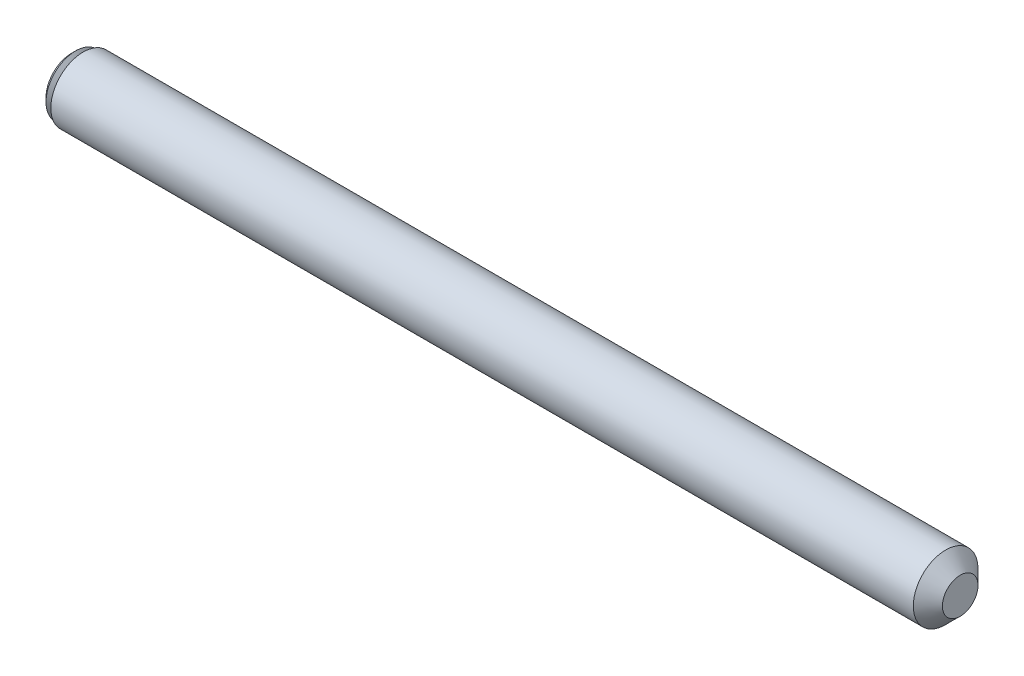
ISO-10303-21;
HEADER;
FILE_DESCRIPTION(('STEP AP214'),'2;1');
FILE_NAME('part.step','',(''),(''),'','','');
FILE_SCHEMA(('AUTOMOTIVE_DESIGN { 1 0 10303 214 1 1 1 1 }'));
ENDSEC;
DATA;
#1=APPLICATION_CONTEXT('core data for automotive mechanical design processes');
#2=APPLICATION_PROTOCOL_DEFINITION('international standard','automotive_design',2000,#1);
#3=PRODUCT_CONTEXT('',#1,'mechanical');
#4=PRODUCT('Part','Part','',(#3));
#5=PRODUCT_RELATED_PRODUCT_CATEGORY('part','',(#4));
#6=PRODUCT_DEFINITION_FORMATION('','',#4);
#7=PRODUCT_DEFINITION_CONTEXT('part definition',#1,'design');
#8=PRODUCT_DEFINITION('design','',#6,#7);
#9=PRODUCT_DEFINITION_SHAPE('','',#8);
#10=(LENGTH_UNIT() NAMED_UNIT(*) SI_UNIT(.MILLI.,.METRE.));
#11=(NAMED_UNIT(*) PLANE_ANGLE_UNIT() SI_UNIT($,.RADIAN.));
#12=(NAMED_UNIT(*) SI_UNIT($,.STERADIAN.) SOLID_ANGLE_UNIT());
#13=UNCERTAINTY_MEASURE_WITH_UNIT(LENGTH_MEASURE(1.E-05),#10,'distance_accuracy_value','');
#14=(GEOMETRIC_REPRESENTATION_CONTEXT(3) GLOBAL_UNCERTAINTY_ASSIGNED_CONTEXT((#13)) GLOBAL_UNIT_ASSIGNED_CONTEXT((#10,
#11,#12)) REPRESENTATION_CONTEXT('',''));
#15=CARTESIAN_POINT('',(0.,0.,0.));
#16=DIRECTION('',(0.,0.,1.));
#17=DIRECTION('',(1.,0.,0.));
#18=AXIS2_PLACEMENT_3D('',#15,#16,#17);
#19=CARTESIAN_POINT('',(108.999999932,2.1844,0.));
#20=DIRECTION('',(1.,0.,0.));
#21=DIRECTION('',(0.,0.,-1.));
#22=AXIS2_PLACEMENT_3D('',#19,#20,#21);
#23=PLANE('',#22);
#24=CARTESIAN_POINT('',(108.999999932,0.,0.));
#25=DIRECTION('',(-1.,0.,0.));
#26=DIRECTION('',(0.,0.,1.));
#27=AXIS2_PLACEMENT_3D('',#24,#25,#26);
#28=CIRCLE('',#27,2.1844);
#29=CARTESIAN_POINT('',(108.999999932,0.,2.1844));
#30=VERTEX_POINT('',#29);
#31=EDGE_CURVE('E10',#30,#30,#28,.T.);
#32=ORIENTED_EDGE('',*,*,#31,.F.);
#33=EDGE_LOOP('',(#32));
#34=FACE_BOUND('',#33,.T.);
#35=ADVANCED_FACE('F31',(#34),#23,.T.);
#36=CARTESIAN_POINT('',(107.215649932,0.,0.));
#37=DIRECTION('',(-1.,0.,0.));
#38=DIRECTION('',(0.,0.,1.));
#39=AXIS2_PLACEMENT_3D('',#36,#37,#38);
#40=CONICAL_SURFACE('',#39,3.96875,0.785398163397397);
#41=ORIENTED_EDGE('',*,*,#31,.T.);
#42=EDGE_LOOP('',(#41));
#43=FACE_BOUND('',#42,.T.);
#44=CARTESIAN_POINT('',(107.215649932,0.,0.));
#45=DIRECTION('',(-1.,0.,0.));
#46=DIRECTION('',(0.,0.,1.));
#47=AXIS2_PLACEMENT_3D('',#44,#45,#46);
#48=CIRCLE('',#47,3.96875);
#49=CARTESIAN_POINT('',(107.215649932,0.,3.96875));
#50=VERTEX_POINT('',#49);
#51=EDGE_CURVE('E38',#50,#50,#48,.T.);
#52=ORIENTED_EDGE('',*,*,#51,.F.);
#53=EDGE_LOOP('',(#52));
#54=FACE_BOUND('',#53,.T.);
#55=ADVANCED_FACE('F65',(#43,#54),#40,.T.);
#56=CARTESIAN_POINT('',(-12.7,0.,0.));
#57=DIRECTION('',(-1.,0.,0.));
#58=DIRECTION('',(0.,0.,1.));
#59=AXIS2_PLACEMENT_3D('',#56,#57,#58);
#60=CYLINDRICAL_SURFACE('',#59,3.96875);
#61=CARTESIAN_POINT('',(1.42727322210089,0.,0.));
#62=DIRECTION('',(-1.,0.,0.));
#63=DIRECTION('',(0.,-1.,0.));
#64=AXIS2_PLACEMENT_3D('',#61,#62,#63);
#65=CIRCLE('',#64,3.96875);
#66=CARTESIAN_POINT('',(1.42727322210089,-3.96875,0.));
#67=VERTEX_POINT('',#66);
#68=EDGE_CURVE('E47',#67,#67,#65,.T.);
#69=ORIENTED_EDGE('',*,*,#68,.F.);
#70=EDGE_LOOP('',(#69));
#71=FACE_BOUND('',#70,.T.);
#72=ORIENTED_EDGE('',*,*,#51,.T.);
#73=EDGE_LOOP('',(#72));
#74=FACE_BOUND('',#73,.T.);
#75=ADVANCED_FACE('F59',(#71,#74),#60,.T.);
#76=CARTESIAN_POINT('',(1.42727322210089,0.,0.));
#77=DIRECTION('',(1.,0.,0.));
#78=DIRECTION('',(0.,1.,0.));
#79=AXIS2_PLACEMENT_3D('',#76,#77,#78);
#80=CONICAL_SURFACE('',#79,3.96875,0.959931088596885);
#81=CARTESIAN_POINT('',(0.839469999999993,0.,0.));
#82=DIRECTION('',(-1.,0.,0.));
#83=DIRECTION('',(0.,-1.,0.));
#84=AXIS2_PLACEMENT_3D('',#81,#82,#83);
#85=CIRCLE('',#84,3.12928);
#86=CARTESIAN_POINT('',(0.839469999999994,-3.12928,0.));
#87=VERTEX_POINT('',#86);
#88=EDGE_CURVE('E50',#87,#87,#85,.T.);
#89=ORIENTED_EDGE('',*,*,#88,.F.);
#90=EDGE_LOOP('',(#89));
#91=FACE_BOUND('',#90,.T.);
#92=ORIENTED_EDGE('',*,*,#68,.T.);
#93=EDGE_LOOP('',(#92));
#94=FACE_BOUND('',#93,.T.);
#95=ADVANCED_FACE('F56',(#91,#94),#80,.T.);
#96=CARTESIAN_POINT('',(0.839469999999993,0.,0.));
#97=DIRECTION('',(-1.,0.,0.));
#98=DIRECTION('',(0.,-1.,0.));
#99=AXIS2_PLACEMENT_3D('',#96,#97,#98);
#100=CONICAL_SURFACE('',#99,3.12928,0.959931088596876);
#101=CARTESIAN_POINT('',(0.49374560524766,0.,0.));
#102=DIRECTION('',(-1.,0.,0.));
#103=DIRECTION('',(0.,-1.,0.));
#104=AXIS2_PLACEMENT_3D('',#101,#102,#103);
#105=CIRCLE('',#104,3.62302560524766);
#106=CARTESIAN_POINT('',(0.49374560524766,-3.62302560524766,0.));
#107=VERTEX_POINT('',#106);
#108=EDGE_CURVE('E34',#107,#107,#105,.F.);
#109=ORIENTED_EDGE('',*,*,#108,.T.);
#110=EDGE_LOOP('',(#109));
#111=FACE_BOUND('',#110,.T.);
#112=ORIENTED_EDGE('',*,*,#88,.T.);
#113=EDGE_LOOP('',(#112));
#114=FACE_BOUND('',#113,.T.);
#115=ADVANCED_FACE('F54',(#111,#114),#100,.T.);
#116=CARTESIAN_POINT('',(0.,0.,0.));
#117=DIRECTION('',(-1.,0.,0.));
#118=DIRECTION('',(0.,0.,1.));
#119=AXIS2_PLACEMENT_3D('',#116,#117,#118);
#120=PLANE('',#119);
#121=CARTESIAN_POINT('',(0.,0.,0.));
#122=DIRECTION('',(-1.,0.,0.));
#123=DIRECTION('',(0.,0.,1.));
#124=AXIS2_PLACEMENT_3D('',#121,#122,#123);
#125=CIRCLE('',#124,3.12928);
#126=CARTESIAN_POINT('',(0.,0.,3.12928));
#127=VERTEX_POINT('',#126);
#128=EDGE_CURVE('E42',#127,#127,#125,.T.);
#129=ORIENTED_EDGE('',*,*,#128,.T.);
#130=EDGE_LOOP('',(#129));
#131=FACE_BOUND('',#130,.T.);
#132=ADVANCED_FACE('F78',(#131),#120,.T.);
#133=CARTESIAN_POINT('',(0.,0.,0.));
#134=DIRECTION('',(1.,0.,0.));
#135=DIRECTION('',(0.,0.,-1.));
#136=AXIS2_PLACEMENT_3D('',#133,#134,#135);
#137=CONICAL_SURFACE('',#136,3.12928,0.785398163397452);
#138=ORIENTED_EDGE('',*,*,#108,.F.);
#139=EDGE_LOOP('',(#138));
#140=FACE_BOUND('',#139,.T.);
#141=ORIENTED_EDGE('',*,*,#128,.F.);
#142=EDGE_LOOP('',(#141));
#143=FACE_BOUND('',#142,.T.);
#144=ADVANCED_FACE('F75',(#140,#143),#137,.T.);
#145=CLOSED_SHELL('',(#35,#55,#75,#95,#115,#132,#144));
#146=MANIFOLD_SOLID_BREP('B2',#145);
#147=ADVANCED_BREP_SHAPE_REPRESENTATION('',(#18,#146),#14);
#148=SHAPE_DEFINITION_REPRESENTATION(#9,#147);
ENDSEC;
END-ISO-10303-21;
